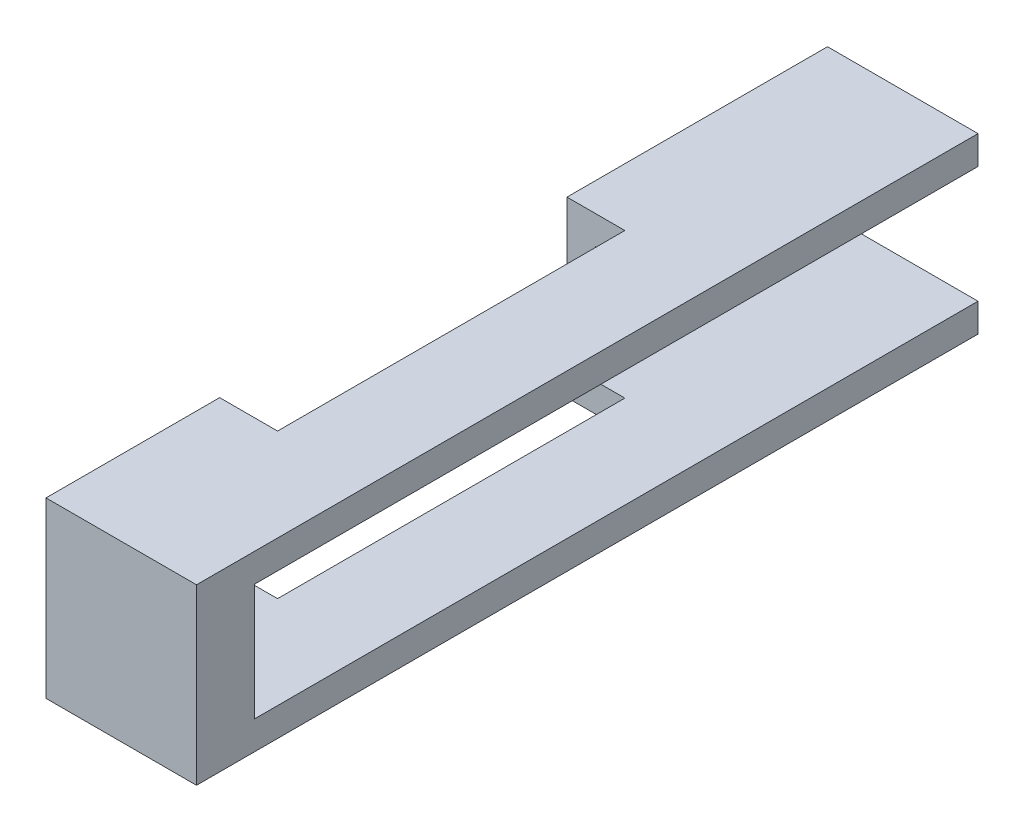
ISO-10303-21;
HEADER;
FILE_DESCRIPTION(('STEP AP214'),'2;1');
FILE_NAME('part.step','',(''),(''),'','','');
FILE_SCHEMA(('AUTOMOTIVE_DESIGN { 1 0 10303 214 1 1 1 1 }'));
ENDSEC;
DATA;
#1=APPLICATION_CONTEXT('core data for automotive mechanical design processes');
#2=APPLICATION_PROTOCOL_DEFINITION('international standard','automotive_design',2000,#1);
#3=PRODUCT_CONTEXT('',#1,'mechanical');
#4=PRODUCT('Part','Part','',(#3));
#5=PRODUCT_RELATED_PRODUCT_CATEGORY('part','',(#4));
#6=PRODUCT_DEFINITION_FORMATION('','',#4);
#7=PRODUCT_DEFINITION_CONTEXT('part definition',#1,'design');
#8=PRODUCT_DEFINITION('design','',#6,#7);
#9=PRODUCT_DEFINITION_SHAPE('','',#8);
#10=(LENGTH_UNIT() NAMED_UNIT(*) SI_UNIT(.MILLI.,.METRE.));
#11=(NAMED_UNIT(*) PLANE_ANGLE_UNIT() SI_UNIT($,.RADIAN.));
#12=(NAMED_UNIT(*) SI_UNIT($,.STERADIAN.) SOLID_ANGLE_UNIT());
#13=UNCERTAINTY_MEASURE_WITH_UNIT(LENGTH_MEASURE(1.E-05),#10,'distance_accuracy_value','');
#14=(GEOMETRIC_REPRESENTATION_CONTEXT(3) GLOBAL_UNCERTAINTY_ASSIGNED_CONTEXT((#13)) GLOBAL_UNIT_ASSIGNED_CONTEXT((#10,
#11,#12)) REPRESENTATION_CONTEXT('',''));
#15=CARTESIAN_POINT('',(0.,0.,0.));
#16=DIRECTION('',(0.,0.,1.));
#17=DIRECTION('',(1.,0.,0.));
#18=AXIS2_PLACEMENT_3D('',#15,#16,#17);
#19=CARTESIAN_POINT('',(0.,30.,0.));
#20=DIRECTION('',(0.,1.,0.));
#21=DIRECTION('',(0.,0.,1.));
#22=AXIS2_PLACEMENT_3D('',#19,#20,#21);
#23=PLANE('',#22);
#24=DIRECTION('',(0.,0.,1.));
#25=VECTOR('',#24,1.);
#26=CARTESIAN_POINT('',(16.,30.,-135.));
#27=LINE('',#26,#25);
#28=CARTESIAN_POINT('',(16.,30.,-120.));
#29=VERTEX_POINT('',#28);
#30=CARTESIAN_POINT('',(16.,30.,15.));
#31=VERTEX_POINT('',#30);
#32=EDGE_CURVE('E229',#29,#31,#27,.T.);
#33=ORIENTED_EDGE('',*,*,#32,.F.);
#34=DIRECTION('',(-1.,0.,0.));
#35=VECTOR('',#34,1.);
#36=CARTESIAN_POINT('',(0.,30.,-120.));
#37=LINE('',#36,#35);
#38=CARTESIAN_POINT('',(-10.,30.,-120.));
#39=VERTEX_POINT('',#38);
#40=EDGE_CURVE('E54',#29,#39,#37,.T.);
#41=ORIENTED_EDGE('',*,*,#40,.T.);
#42=DIRECTION('',(0.,0.,-1.));
#43=VECTOR('',#42,1.);
#44=CARTESIAN_POINT('',(-10.,30.,-75.));
#45=LINE('',#44,#43);
#46=CARTESIAN_POINT('',(-10.,30.,-75.));
#47=VERTEX_POINT('',#46);
#48=EDGE_CURVE('E166',#47,#39,#45,.T.);
#49=ORIENTED_EDGE('',*,*,#48,.F.);
#50=DIRECTION('',(-1.,0.,0.));
#51=VECTOR('',#50,1.);
#52=CARTESIAN_POINT('',(0.,30.,-75.));
#53=LINE('',#52,#51);
#54=CARTESIAN_POINT('',(0.,30.,-75.));
#55=VERTEX_POINT('',#54);
#56=EDGE_CURVE('E289',#55,#47,#53,.T.);
#57=ORIENTED_EDGE('',*,*,#56,.F.);
#58=DIRECTION('',(0.,0.,1.));
#59=VECTOR('',#58,1.);
#60=CARTESIAN_POINT('',(0.,30.,-135.));
#61=LINE('',#60,#59);
#62=CARTESIAN_POINT('',(0.,30.,-15.));
#63=VERTEX_POINT('',#62);
#64=EDGE_CURVE('E189',#55,#63,#61,.T.);
#65=ORIENTED_EDGE('',*,*,#64,.T.);
#66=DIRECTION('',(-1.,0.,0.));
#67=VECTOR('',#66,1.);
#68=CARTESIAN_POINT('',(-15.,30.,-15.));
#69=LINE('',#68,#67);
#70=CARTESIAN_POINT('',(-9.99999999999998,30.,-15.));
#71=VERTEX_POINT('',#70);
#72=EDGE_CURVE('E204',#63,#71,#69,.T.);
#73=ORIENTED_EDGE('',*,*,#72,.T.);
#74=DIRECTION('',(0.,0.,-1.));
#75=VECTOR('',#74,1.);
#76=CARTESIAN_POINT('',(-9.99999999999998,30.,0.));
#77=LINE('',#76,#75);
#78=CARTESIAN_POINT('',(-9.99999999999998,30.,15.));
#79=VERTEX_POINT('',#78);
#80=EDGE_CURVE('E200',#79,#71,#77,.T.);
#81=ORIENTED_EDGE('',*,*,#80,.F.);
#82=DIRECTION('',(1.,0.,0.));
#83=VECTOR('',#82,1.);
#84=CARTESIAN_POINT('',(-15.,30.,15.));
#85=LINE('',#84,#83);
#86=EDGE_CURVE('E206',#79,#31,#85,.T.);
#87=ORIENTED_EDGE('',*,*,#86,.T.);
#88=EDGE_LOOP('',(#33,#41,#49,#57,#65,#73,#81,#87));
#89=FACE_BOUND('',#88,.T.);
#90=ADVANCED_FACE('F39',(#89),#23,.T.);
#91=CARTESIAN_POINT('',(0.,0.,0.));
#92=DIRECTION('',(0.,1.,0.));
#93=DIRECTION('',(0.,0.,1.));
#94=AXIS2_PLACEMENT_3D('',#91,#92,#93);
#95=PLANE('',#94);
#96=DIRECTION('',(1.,0.,0.));
#97=VECTOR('',#96,1.);
#98=CARTESIAN_POINT('',(0.,0.,-120.));
#99=LINE('',#98,#97);
#100=CARTESIAN_POINT('',(-10.,0.,-120.));
#101=VERTEX_POINT('',#100);
#102=CARTESIAN_POINT('',(16.,0.,-120.));
#103=VERTEX_POINT('',#102);
#104=EDGE_CURVE('E150',#101,#103,#99,.T.);
#105=ORIENTED_EDGE('',*,*,#104,.T.);
#106=DIRECTION('',(0.,0.,-1.));
#107=VECTOR('',#106,1.);
#108=CARTESIAN_POINT('',(16.,0.,15.));
#109=LINE('',#108,#107);
#110=CARTESIAN_POINT('',(16.,0.,15.));
#111=VERTEX_POINT('',#110);
#112=EDGE_CURVE('E240',#111,#103,#109,.T.);
#113=ORIENTED_EDGE('',*,*,#112,.F.);
#114=DIRECTION('',(1.,0.,0.));
#115=VECTOR('',#114,1.);
#116=CARTESIAN_POINT('',(-15.,0.,15.));
#117=LINE('',#116,#115);
#118=CARTESIAN_POINT('',(-9.99999999999998,0.,15.));
#119=VERTEX_POINT('',#118);
#120=EDGE_CURVE('E207',#119,#111,#117,.T.);
#121=ORIENTED_EDGE('',*,*,#120,.F.);
#122=DIRECTION('',(0.,0.,1.));
#123=VECTOR('',#122,1.);
#124=CARTESIAN_POINT('',(-9.99999999999998,0.,0.));
#125=LINE('',#124,#123);
#126=CARTESIAN_POINT('',(-9.99999999999999,0.,-15.));
#127=VERTEX_POINT('',#126);
#128=EDGE_CURVE('E191',#127,#119,#125,.T.);
#129=ORIENTED_EDGE('',*,*,#128,.F.);
#130=DIRECTION('',(-1.,0.,0.));
#131=VECTOR('',#130,1.);
#132=CARTESIAN_POINT('',(-15.,0.,-15.));
#133=LINE('',#132,#131);
#134=CARTESIAN_POINT('',(0.,0.,-15.));
#135=VERTEX_POINT('',#134);
#136=EDGE_CURVE('E203',#135,#127,#133,.T.);
#137=ORIENTED_EDGE('',*,*,#136,.F.);
#138=DIRECTION('',(0.,0.,1.));
#139=VECTOR('',#138,1.);
#140=CARTESIAN_POINT('',(0.,0.,-135.));
#141=LINE('',#140,#139);
#142=CARTESIAN_POINT('',(0.,0.,-75.));
#143=VERTEX_POINT('',#142);
#144=EDGE_CURVE('E183',#143,#135,#141,.T.);
#145=ORIENTED_EDGE('',*,*,#144,.F.);
#146=DIRECTION('',(-1.,0.,0.));
#147=VECTOR('',#146,1.);
#148=CARTESIAN_POINT('',(0.,0.,-75.));
#149=LINE('',#148,#147);
#150=CARTESIAN_POINT('',(-10.,0.,-75.));
#151=VERTEX_POINT('',#150);
#152=EDGE_CURVE('E173',#143,#151,#149,.T.);
#153=ORIENTED_EDGE('',*,*,#152,.T.);
#154=DIRECTION('',(0.,0.,-1.));
#155=VECTOR('',#154,1.);
#156=CARTESIAN_POINT('',(-10.,0.,-75.));
#157=LINE('',#156,#155);
#158=EDGE_CURVE('E163',#151,#101,#157,.T.);
#159=ORIENTED_EDGE('',*,*,#158,.T.);
#160=EDGE_LOOP('',(#105,#113,#121,#129,#137,#145,#153,#159));
#161=FACE_BOUND('',#160,.T.);
#162=ADVANCED_FACE('F170',(#161),#95,.F.);
#163=CARTESIAN_POINT('',(-10.,0.,-75.));
#164=DIRECTION('',(-1.,0.,0.));
#165=DIRECTION('',(0.,0.,1.));
#166=AXIS2_PLACEMENT_3D('',#163,#164,#165);
#167=PLANE('',#166);
#168=CARTESIAN_POINT('',(-10.,14.9999999999823,-104.999999999998));
#169=DIRECTION('',(-1.,0.,0.));
#170=DIRECTION('',(0.,0.,1.));
#171=AXIS2_PLACEMENT_3D('',#168,#169,#170);
#172=CIRCLE('',#171,3.09999999999978);
#173=CARTESIAN_POINT('',(-10.,14.9999999999823,-101.899999999999));
#174=VERTEX_POINT('',#173);
#175=EDGE_CURVE('E281',#174,#174,#172,.T.);
#176=ORIENTED_EDGE('',*,*,#175,.F.);
#177=EDGE_LOOP('',(#176));
#178=FACE_BOUND('',#177,.T.);
#179=CARTESIAN_POINT('',(-10.,14.9999999999823,-85.0000000000015));
#180=DIRECTION('',(-1.,0.,0.));
#181=DIRECTION('',(0.,0.,1.));
#182=AXIS2_PLACEMENT_3D('',#179,#180,#181);
#183=CIRCLE('',#182,3.09999999999979);
#184=CARTESIAN_POINT('',(-10.,14.9999999999823,-81.9000000000017));
#185=VERTEX_POINT('',#184);
#186=EDGE_CURVE('E280',#185,#185,#183,.T.);
#187=ORIENTED_EDGE('',*,*,#186,.F.);
#188=EDGE_LOOP('',(#187));
#189=FACE_BOUND('',#188,.T.);
#190=ORIENTED_EDGE('',*,*,#48,.T.);
#191=DIRECTION('',(0.,-1.,0.));
#192=VECTOR('',#191,1.);
#193=CARTESIAN_POINT('',(-10.,87.,-120.));
#194=LINE('',#193,#192);
#195=EDGE_CURVE('E153',#39,#101,#194,.T.);
#196=ORIENTED_EDGE('',*,*,#195,.T.);
#197=ORIENTED_EDGE('',*,*,#158,.F.);
#198=DIRECTION('',(0.,1.,0.));
#199=VECTOR('',#198,1.);
#200=CARTESIAN_POINT('',(-10.,0.,-75.));
#201=LINE('',#200,#199);
#202=EDGE_CURVE('E287',#151,#47,#201,.T.);
#203=ORIENTED_EDGE('',*,*,#202,.T.);
#204=EDGE_LOOP('',(#190,#196,#197,#203));
#205=FACE_BOUND('',#204,.T.);
#206=ADVANCED_FACE('F161',(#178,#189,#205),#167,.T.);
#207=CARTESIAN_POINT('',(15.05,4.925,33.461069902588));
#208=DIRECTION('',(0.,-1.,0.));
#209=DIRECTION('',(0.,0.,-1.));
#210=AXIS2_PLACEMENT_3D('',#207,#208,#209);
#211=PLANE('',#210);
#212=DIRECTION('',(1.,0.,0.));
#213=VECTOR('',#212,1.);
#214=CARTESIAN_POINT('',(15.05,4.925,-120.));
#215=LINE('',#214,#213);
#216=CARTESIAN_POINT('',(-5.04999999999999,4.925,-120.));
#217=VERTEX_POINT('',#216);
#218=CARTESIAN_POINT('',(16.,4.925,-120.));
#219=VERTEX_POINT('',#218);
#220=EDGE_CURVE('E320',#217,#219,#215,.T.);
#221=ORIENTED_EDGE('',*,*,#220,.F.);
#222=DIRECTION('',(0.,0.,-1.));
#223=VECTOR('',#222,1.);
#224=CARTESIAN_POINT('',(-5.04999999999999,4.925,33.461069902588));
#225=LINE('',#224,#223);
#226=CARTESIAN_POINT('',(-5.04999999999999,4.925,-75.));
#227=VERTEX_POINT('',#226);
#228=EDGE_CURVE('E256',#227,#217,#225,.T.);
#229=ORIENTED_EDGE('',*,*,#228,.F.);
#230=DIRECTION('',(-1.,0.,0.));
#231=VECTOR('',#230,1.);
#232=CARTESIAN_POINT('',(0.,4.925,-75.));
#233=LINE('',#232,#231);
#234=CARTESIAN_POINT('',(0.,4.925,-75.));
#235=VERTEX_POINT('',#234);
#236=EDGE_CURVE('E220',#235,#227,#233,.T.);
#237=ORIENTED_EDGE('',*,*,#236,.F.);
#238=DIRECTION('',(0.,0.,1.));
#239=VECTOR('',#238,1.);
#240=CARTESIAN_POINT('',(0.,4.925,-135.));
#241=LINE('',#240,#239);
#242=CARTESIAN_POINT('',(0.,4.925,-15.));
#243=VERTEX_POINT('',#242);
#244=EDGE_CURVE('E275',#235,#243,#241,.T.);
#245=ORIENTED_EDGE('',*,*,#244,.T.);
#246=DIRECTION('',(1.,0.,0.));
#247=VECTOR('',#246,1.);
#248=CARTESIAN_POINT('',(-15.,4.925,-15.));
#249=LINE('',#248,#247);
#250=CARTESIAN_POINT('',(-5.04999999999999,4.925,-15.));
#251=VERTEX_POINT('',#250);
#252=EDGE_CURVE('E277',#251,#243,#249,.T.);
#253=ORIENTED_EDGE('',*,*,#252,.F.);
#254=CARTESIAN_POINT('',(-5.04999999999999,4.925,5.));
#255=VERTEX_POINT('',#254);
#256=EDGE_CURVE('E254',#255,#251,#225,.T.);
#257=ORIENTED_EDGE('',*,*,#256,.F.);
#258=DIRECTION('',(-1.,0.,0.));
#259=VECTOR('',#258,1.);
#260=CARTESIAN_POINT('',(15.05,4.925,5.));
#261=LINE('',#260,#259);
#262=CARTESIAN_POINT('',(16.,4.925,5.));
#263=VERTEX_POINT('',#262);
#264=EDGE_CURVE('E247',#263,#255,#261,.T.);
#265=ORIENTED_EDGE('',*,*,#264,.F.);
#266=DIRECTION('',(0.,0.,1.));
#267=VECTOR('',#266,1.);
#268=CARTESIAN_POINT('',(16.,4.925,-135.));
#269=LINE('',#268,#267);
#270=EDGE_CURVE('E314',#219,#263,#269,.T.);
#271=ORIENTED_EDGE('',*,*,#270,.F.);
#272=EDGE_LOOP('',(#221,#229,#237,#245,#253,#257,#265,#271));
#273=FACE_BOUND('',#272,.T.);
#274=ADVANCED_FACE('F318',(#273),#211,.F.);
#275=CARTESIAN_POINT('',(-5.04999999999999,25.075,33.461069902588));
#276=DIRECTION('',(0.,1.,0.));
#277=DIRECTION('',(0.,0.,1.));
#278=AXIS2_PLACEMENT_3D('',#275,#276,#277);
#279=PLANE('',#278);
#280=DIRECTION('',(-1.,0.,0.));
#281=VECTOR('',#280,1.);
#282=CARTESIAN_POINT('',(-5.04999999999999,25.075,-120.));
#283=LINE('',#282,#281);
#284=CARTESIAN_POINT('',(16.,25.075,-120.));
#285=VERTEX_POINT('',#284);
#286=CARTESIAN_POINT('',(-5.04999999999999,25.075,-120.));
#287=VERTEX_POINT('',#286);
#288=EDGE_CURVE('E328',#285,#287,#283,.T.);
#289=ORIENTED_EDGE('',*,*,#288,.F.);
#290=DIRECTION('',(0.,0.,-1.));
#291=VECTOR('',#290,1.);
#292=CARTESIAN_POINT('',(16.,25.075,5.));
#293=LINE('',#292,#291);
#294=CARTESIAN_POINT('',(16.,25.075,5.));
#295=VERTEX_POINT('',#294);
#296=EDGE_CURVE('E232',#295,#285,#293,.T.);
#297=ORIENTED_EDGE('',*,*,#296,.F.);
#298=DIRECTION('',(1.,0.,0.));
#299=VECTOR('',#298,1.);
#300=CARTESIAN_POINT('',(-5.05,25.075,5.));
#301=LINE('',#300,#299);
#302=CARTESIAN_POINT('',(-5.04999999999999,25.075,5.));
#303=VERTEX_POINT('',#302);
#304=EDGE_CURVE('E219',#303,#295,#301,.T.);
#305=ORIENTED_EDGE('',*,*,#304,.F.);
#306=DIRECTION('',(0.,0.,-1.));
#307=VECTOR('',#306,1.);
#308=CARTESIAN_POINT('',(-5.04999999999999,25.075,33.461069902588));
#309=LINE('',#308,#307);
#310=CARTESIAN_POINT('',(-5.04999999999999,25.075,-15.));
#311=VERTEX_POINT('',#310);
#312=EDGE_CURVE('E249',#303,#311,#309,.T.);
#313=ORIENTED_EDGE('',*,*,#312,.T.);
#314=DIRECTION('',(-1.,0.,0.));
#315=VECTOR('',#314,1.);
#316=CARTESIAN_POINT('',(-15.,25.075,-15.));
#317=LINE('',#316,#315);
#318=CARTESIAN_POINT('',(0.,25.075,-15.));
#319=VERTEX_POINT('',#318);
#320=EDGE_CURVE('E272',#319,#311,#317,.T.);
#321=ORIENTED_EDGE('',*,*,#320,.F.);
#322=DIRECTION('',(0.,0.,-1.));
#323=VECTOR('',#322,1.);
#324=CARTESIAN_POINT('',(0.,25.075,-135.));
#325=LINE('',#324,#323);
#326=CARTESIAN_POINT('',(0.,25.075,-75.));
#327=VERTEX_POINT('',#326);
#328=EDGE_CURVE('E62',#319,#327,#325,.T.);
#329=ORIENTED_EDGE('',*,*,#328,.T.);
#330=DIRECTION('',(1.,0.,0.));
#331=VECTOR('',#330,1.);
#332=CARTESIAN_POINT('',(0.,25.075,-75.));
#333=LINE('',#332,#331);
#334=CARTESIAN_POINT('',(-5.04999999999999,25.075,-75.));
#335=VERTEX_POINT('',#334);
#336=EDGE_CURVE('E210',#335,#327,#333,.T.);
#337=ORIENTED_EDGE('',*,*,#336,.F.);
#338=EDGE_CURVE('E253',#335,#287,#309,.T.);
#339=ORIENTED_EDGE('',*,*,#338,.T.);
#340=EDGE_LOOP('',(#289,#297,#305,#313,#321,#329,#337,#339));
#341=FACE_BOUND('',#340,.T.);
#342=ADVANCED_FACE('F335',(#341),#279,.F.);
#343=CARTESIAN_POINT('',(-5.04999999999999,4.925,33.461069902588));
#344=DIRECTION('',(-1.,0.,0.));
#345=DIRECTION('',(0.,0.,1.));
#346=AXIS2_PLACEMENT_3D('',#343,#344,#345);
#347=PLANE('',#346);
#348=CARTESIAN_POINT('',(-5.04999999999999,14.9999999999823,-85.0000000000015));
#349=DIRECTION('',(-1.,0.,0.));
#350=DIRECTION('',(0.,0.,1.));
#351=AXIS2_PLACEMENT_3D('',#348,#349,#350);
#352=CIRCLE('',#351,3.09999999999979);
#353=CARTESIAN_POINT('',(-5.04999999999999,14.9999999999823,-81.9000000000017));
#354=VERTEX_POINT('',#353);
#355=EDGE_CURVE('E218',#354,#354,#352,.F.);
#356=ORIENTED_EDGE('',*,*,#355,.F.);
#357=EDGE_LOOP('',(#356));
#358=FACE_BOUND('',#357,.T.);
#359=CARTESIAN_POINT('',(-5.04999999999999,14.9999999999823,-104.999999999998));
#360=DIRECTION('',(-1.,0.,0.));
#361=DIRECTION('',(0.,0.,1.));
#362=AXIS2_PLACEMENT_3D('',#359,#360,#361);
#363=CIRCLE('',#362,3.09999999999978);
#364=CARTESIAN_POINT('',(-5.04999999999999,14.9999999999823,-101.899999999999));
#365=VERTEX_POINT('',#364);
#366=EDGE_CURVE('E215',#365,#365,#363,.F.);
#367=ORIENTED_EDGE('',*,*,#366,.F.);
#368=EDGE_LOOP('',(#367));
#369=FACE_BOUND('',#368,.T.);
#370=DIRECTION('',(0.,-1.,0.));
#371=VECTOR('',#370,1.);
#372=CARTESIAN_POINT('',(-5.04999999999999,4.925,-120.));
#373=LINE('',#372,#371);
#374=EDGE_CURVE('E167',#287,#217,#373,.T.);
#375=ORIENTED_EDGE('',*,*,#374,.F.);
#376=ORIENTED_EDGE('',*,*,#338,.F.);
#377=DIRECTION('',(0.,1.,0.));
#378=VECTOR('',#377,1.);
#379=CARTESIAN_POINT('',(-5.04999999999999,0.,-75.));
#380=LINE('',#379,#378);
#381=EDGE_CURVE('E263',#227,#335,#380,.T.);
#382=ORIENTED_EDGE('',*,*,#381,.F.);
#383=ORIENTED_EDGE('',*,*,#228,.T.);
#384=EDGE_LOOP('',(#375,#376,#382,#383));
#385=FACE_BOUND('',#384,.T.);
#386=ADVANCED_FACE('F334',(#358,#369,#385),#347,.F.);
#387=CARTESIAN_POINT('',(16.,0.,0.));
#388=DIRECTION('',(1.,0.,0.));
#389=DIRECTION('',(0.,0.,-1.));
#390=AXIS2_PLACEMENT_3D('',#387,#388,#389);
#391=PLANE('',#390);
#392=ORIENTED_EDGE('',*,*,#112,.T.);
#393=DIRECTION('',(0.,1.,0.));
#394=VECTOR('',#393,1.);
#395=CARTESIAN_POINT('',(16.,0.,-120.));
#396=LINE('',#395,#394);
#397=EDGE_CURVE('E11',#103,#219,#396,.T.);
#398=ORIENTED_EDGE('',*,*,#397,.T.);
#399=ORIENTED_EDGE('',*,*,#270,.T.);
#400=DIRECTION('',(0.,1.,0.));
#401=VECTOR('',#400,1.);
#402=CARTESIAN_POINT('',(16.,4.925,5.));
#403=LINE('',#402,#401);
#404=EDGE_CURVE('E242',#263,#295,#403,.T.);
#405=ORIENTED_EDGE('',*,*,#404,.T.);
#406=ORIENTED_EDGE('',*,*,#296,.T.);
#407=EDGE_CURVE('E43',#285,#29,#396,.T.);
#408=ORIENTED_EDGE('',*,*,#407,.T.);
#409=ORIENTED_EDGE('',*,*,#32,.T.);
#410=DIRECTION('',(0.,-1.,0.));
#411=VECTOR('',#410,1.);
#412=CARTESIAN_POINT('',(16.,30.,15.));
#413=LINE('',#412,#411);
#414=EDGE_CURVE('E238',#31,#111,#413,.T.);
#415=ORIENTED_EDGE('',*,*,#414,.T.);
#416=EDGE_LOOP('',(#392,#398,#399,#405,#406,#408,#409,#415));
#417=FACE_BOUND('',#416,.T.);
#418=ADVANCED_FACE('F227',(#417),#391,.T.);
#419=CARTESIAN_POINT('',(0.,0.,-135.));
#420=DIRECTION('',(-1.,0.,0.));
#421=DIRECTION('',(0.,-1.,0.));
#422=AXIS2_PLACEMENT_3D('',#419,#420,#421);
#423=PLANE('',#422);
#424=ORIENTED_EDGE('',*,*,#328,.F.);
#425=DIRECTION('',(0.,-1.,0.));
#426=VECTOR('',#425,1.);
#427=CARTESIAN_POINT('',(0.,0.,-15.));
#428=LINE('',#427,#426);
#429=EDGE_CURVE('E186',#63,#319,#428,.T.);
#430=ORIENTED_EDGE('',*,*,#429,.F.);
#431=ORIENTED_EDGE('',*,*,#64,.F.);
#432=DIRECTION('',(0.,1.,0.));
#433=VECTOR('',#432,1.);
#434=CARTESIAN_POINT('',(0.,0.,-75.));
#435=LINE('',#434,#433);
#436=EDGE_CURVE('E179',#327,#55,#435,.T.);
#437=ORIENTED_EDGE('',*,*,#436,.F.);
#438=EDGE_LOOP('',(#424,#430,#431,#437));
#439=FACE_BOUND('',#438,.T.);
#440=ADVANCED_FACE('F297',(#439),#423,.T.);
#441=CARTESIAN_POINT('',(0.,0.,-135.));
#442=DIRECTION('',(-1.,0.,0.));
#443=DIRECTION('',(0.,-1.,0.));
#444=AXIS2_PLACEMENT_3D('',#441,#442,#443);
#445=PLANE('',#444);
#446=ORIENTED_EDGE('',*,*,#244,.F.);
#447=DIRECTION('',(0.,1.,0.));
#448=VECTOR('',#447,1.);
#449=CARTESIAN_POINT('',(0.,0.,-75.));
#450=LINE('',#449,#448);
#451=EDGE_CURVE('E174',#143,#235,#450,.T.);
#452=ORIENTED_EDGE('',*,*,#451,.F.);
#453=ORIENTED_EDGE('',*,*,#144,.T.);
#454=DIRECTION('',(0.,-1.,0.));
#455=VECTOR('',#454,1.);
#456=CARTESIAN_POINT('',(0.,0.,-15.));
#457=LINE('',#456,#455);
#458=EDGE_CURVE('E176',#243,#135,#457,.T.);
#459=ORIENTED_EDGE('',*,*,#458,.F.);
#460=EDGE_LOOP('',(#446,#452,#453,#459));
#461=FACE_BOUND('',#460,.T.);
#462=ADVANCED_FACE('F301',(#461),#445,.T.);
#463=CARTESIAN_POINT('',(-15.,30.,-15.));
#464=DIRECTION('',(0.,0.,1.));
#465=DIRECTION('',(1.,0.,0.));
#466=AXIS2_PLACEMENT_3D('',#463,#464,#465);
#467=PLANE('',#466);
#468=DIRECTION('',(0.,-1.,0.));
#469=VECTOR('',#468,1.);
#470=CARTESIAN_POINT('',(-5.04999999999999,30.,-15.));
#471=LINE('',#470,#469);
#472=EDGE_CURVE('E268',#311,#251,#471,.T.);
#473=ORIENTED_EDGE('',*,*,#472,.T.);
#474=ORIENTED_EDGE('',*,*,#252,.T.);
#475=ORIENTED_EDGE('',*,*,#458,.T.);
#476=ORIENTED_EDGE('',*,*,#136,.T.);
#477=DIRECTION('',(0.,-1.,0.));
#478=VECTOR('',#477,1.);
#479=CARTESIAN_POINT('',(-9.99999999999998,55.,-15.));
#480=LINE('',#479,#478);
#481=EDGE_CURVE('E193',#71,#127,#480,.T.);
#482=ORIENTED_EDGE('',*,*,#481,.F.);
#483=ORIENTED_EDGE('',*,*,#72,.F.);
#484=ORIENTED_EDGE('',*,*,#429,.T.);
#485=ORIENTED_EDGE('',*,*,#320,.T.);
#486=EDGE_LOOP('',(#473,#474,#475,#476,#482,#483,#484,#485));
#487=FACE_BOUND('',#486,.T.);
#488=ADVANCED_FACE('F41',(#487),#467,.F.);
#489=CARTESIAN_POINT('',(-15.,30.,15.));
#490=DIRECTION('',(0.,0.,-1.));
#491=DIRECTION('',(-1.,0.,0.));
#492=AXIS2_PLACEMENT_3D('',#489,#490,#491);
#493=PLANE('',#492);
#494=ORIENTED_EDGE('',*,*,#86,.F.);
#495=DIRECTION('',(0.,-1.,0.));
#496=VECTOR('',#495,1.);
#497=CARTESIAN_POINT('',(-9.99999999999998,55.,15.));
#498=LINE('',#497,#496);
#499=EDGE_CURVE('E194',#79,#119,#498,.T.);
#500=ORIENTED_EDGE('',*,*,#499,.T.);
#501=ORIENTED_EDGE('',*,*,#120,.T.);
#502=ORIENTED_EDGE('',*,*,#414,.F.);
#503=EDGE_LOOP('',(#494,#500,#501,#502));
#504=FACE_BOUND('',#503,.T.);
#505=ADVANCED_FACE('F312',(#504),#493,.F.);
#506=CARTESIAN_POINT('',(-4.99999999999999,4.975,5.));
#507=DIRECTION('',(0.,0.,1.));
#508=DIRECTION('',(1.,0.,0.));
#509=AXIS2_PLACEMENT_3D('',#506,#507,#508);
#510=PLANE('',#509);
#511=ORIENTED_EDGE('',*,*,#304,.T.);
#512=ORIENTED_EDGE('',*,*,#404,.F.);
#513=ORIENTED_EDGE('',*,*,#264,.T.);
#514=DIRECTION('',(0.,1.,0.));
#515=VECTOR('',#514,1.);
#516=CARTESIAN_POINT('',(-5.04999999999999,4.925,5.));
#517=LINE('',#516,#515);
#518=EDGE_CURVE('E250',#255,#303,#517,.T.);
#519=ORIENTED_EDGE('',*,*,#518,.T.);
#520=EDGE_LOOP('',(#511,#512,#513,#519));
#521=FACE_BOUND('',#520,.T.);
#522=ADVANCED_FACE('F341',(#521),#510,.F.);
#523=CARTESIAN_POINT('',(-25.,15.,-5.));
#524=DIRECTION('',(1.,0.,0.));
#525=DIRECTION('',(0.,0.,-1.));
#526=AXIS2_PLACEMENT_3D('',#523,#524,#525);
#527=CYLINDRICAL_SURFACE('',#526,3.1);
#528=CARTESIAN_POINT('',(-5.04999999999999,15.,-5.));
#529=DIRECTION('',(-1.,0.,0.));
#530=DIRECTION('',(0.,0.,1.));
#531=AXIS2_PLACEMENT_3D('',#528,#529,#530);
#532=CIRCLE('',#531,3.1);
#533=CARTESIAN_POINT('',(-5.04999999999999,15.,-1.9));
#534=VERTEX_POINT('',#533);
#535=EDGE_CURVE('E265',#534,#534,#532,.F.);
#536=ORIENTED_EDGE('',*,*,#535,.T.);
#537=EDGE_LOOP('',(#536));
#538=FACE_BOUND('',#537,.T.);
#539=CARTESIAN_POINT('',(-9.99999999999998,15.,-5.));
#540=DIRECTION('',(1.,0.,0.));
#541=DIRECTION('',(0.,0.,-1.));
#542=AXIS2_PLACEMENT_3D('',#539,#540,#541);
#543=CIRCLE('',#542,3.1);
#544=CARTESIAN_POINT('',(-9.99999999999998,15.,-8.1));
#545=VERTEX_POINT('',#544);
#546=EDGE_CURVE('E197',#545,#545,#543,.F.);
#547=ORIENTED_EDGE('',*,*,#546,.T.);
#548=EDGE_LOOP('',(#547));
#549=FACE_BOUND('',#548,.T.);
#550=ADVANCED_FACE('F343',(#538,#549),#527,.F.);
#551=CARTESIAN_POINT('',(-9.99999999999998,55.,0.));
#552=DIRECTION('',(1.,0.,0.));
#553=DIRECTION('',(0.,0.,-1.));
#554=AXIS2_PLACEMENT_3D('',#551,#552,#553);
#555=PLANE('',#554);
#556=ORIENTED_EDGE('',*,*,#80,.T.);
#557=ORIENTED_EDGE('',*,*,#481,.T.);
#558=ORIENTED_EDGE('',*,*,#128,.T.);
#559=ORIENTED_EDGE('',*,*,#499,.F.);
#560=EDGE_LOOP('',(#556,#557,#558,#559));
#561=FACE_BOUND('',#560,.T.);
#562=ORIENTED_EDGE('',*,*,#546,.F.);
#563=EDGE_LOOP('',(#562));
#564=FACE_BOUND('',#563,.T.);
#565=ADVANCED_FACE('F309',(#561,#564),#555,.F.);
#566=CARTESIAN_POINT('',(0.,0.,-75.));
#567=DIRECTION('',(0.,0.,-1.));
#568=DIRECTION('',(-1.,0.,0.));
#569=AXIS2_PLACEMENT_3D('',#566,#567,#568);
#570=PLANE('',#569);
#571=ORIENTED_EDGE('',*,*,#451,.T.);
#572=ORIENTED_EDGE('',*,*,#236,.T.);
#573=ORIENTED_EDGE('',*,*,#381,.T.);
#574=ORIENTED_EDGE('',*,*,#336,.T.);
#575=ORIENTED_EDGE('',*,*,#436,.T.);
#576=ORIENTED_EDGE('',*,*,#56,.T.);
#577=ORIENTED_EDGE('',*,*,#202,.F.);
#578=ORIENTED_EDGE('',*,*,#152,.F.);
#579=EDGE_LOOP('',(#571,#572,#573,#574,#575,#576,#577,#578));
#580=FACE_BOUND('',#579,.T.);
#581=ADVANCED_FACE('F293',(#580),#570,.F.);
#582=CARTESIAN_POINT('',(50.,14.9999999999823,-85.0000000000015));
#583=DIRECTION('',(-1.,0.,0.));
#584=DIRECTION('',(0.,0.,1.));
#585=AXIS2_PLACEMENT_3D('',#582,#583,#584);
#586=CYLINDRICAL_SURFACE('',#585,3.09999999999979);
#587=ORIENTED_EDGE('',*,*,#355,.T.);
#588=EDGE_LOOP('',(#587));
#589=FACE_BOUND('',#588,.T.);
#590=ORIENTED_EDGE('',*,*,#186,.T.);
#591=EDGE_LOOP('',(#590));
#592=FACE_BOUND('',#591,.T.);
#593=ADVANCED_FACE('F380',(#589,#592),#586,.F.);
#594=CARTESIAN_POINT('',(50.,14.9999999999823,-104.999999999998));
#595=DIRECTION('',(-1.,0.,0.));
#596=DIRECTION('',(0.,0.,1.));
#597=AXIS2_PLACEMENT_3D('',#594,#595,#596);
#598=CYLINDRICAL_SURFACE('',#597,3.09999999999978);
#599=ORIENTED_EDGE('',*,*,#366,.T.);
#600=EDGE_LOOP('',(#599));
#601=FACE_BOUND('',#600,.T.);
#602=ORIENTED_EDGE('',*,*,#175,.T.);
#603=EDGE_LOOP('',(#602));
#604=FACE_BOUND('',#603,.T.);
#605=ADVANCED_FACE('F384',(#601,#604),#598,.F.);
#606=ORIENTED_EDGE('',*,*,#535,.F.);
#607=EDGE_LOOP('',(#606));
#608=FACE_BOUND('',#607,.T.);
#609=ORIENTED_EDGE('',*,*,#312,.F.);
#610=ORIENTED_EDGE('',*,*,#518,.F.);
#611=ORIENTED_EDGE('',*,*,#256,.T.);
#612=ORIENTED_EDGE('',*,*,#472,.F.);
#613=EDGE_LOOP('',(#609,#610,#611,#612));
#614=FACE_BOUND('',#613,.T.);
#615=ADVANCED_FACE('F340',(#608,#614),#347,.F.);
#616=CARTESIAN_POINT('',(0.,87.,-120.));
#617=DIRECTION('',(0.,0.,-1.));
#618=DIRECTION('',(-1.,0.,0.));
#619=AXIS2_PLACEMENT_3D('',#616,#617,#618);
#620=PLANE('',#619);
#621=ORIENTED_EDGE('',*,*,#407,.F.);
#622=ORIENTED_EDGE('',*,*,#288,.T.);
#623=ORIENTED_EDGE('',*,*,#374,.T.);
#624=ORIENTED_EDGE('',*,*,#220,.T.);
#625=ORIENTED_EDGE('',*,*,#397,.F.);
#626=ORIENTED_EDGE('',*,*,#104,.F.);
#627=ORIENTED_EDGE('',*,*,#195,.F.);
#628=ORIENTED_EDGE('',*,*,#40,.F.);
#629=EDGE_LOOP('',(#621,#622,#623,#624,#625,#626,#627,#628));
#630=FACE_BOUND('',#629,.T.);
#631=ADVANCED_FACE('F152',(#630),#620,.T.);
#632=CLOSED_SHELL('',(#90,#162,#206,#274,#342,#386,#418,#440,#462,#488,#505,#522,#550,#565,#581,
#593,#605,#615,#631));
#633=MANIFOLD_SOLID_BREP('B2',#632);
#634=ADVANCED_BREP_SHAPE_REPRESENTATION('',(#18,#633),#14);
#635=SHAPE_DEFINITION_REPRESENTATION(#9,#634);
ENDSEC;
END-ISO-10303-21;
